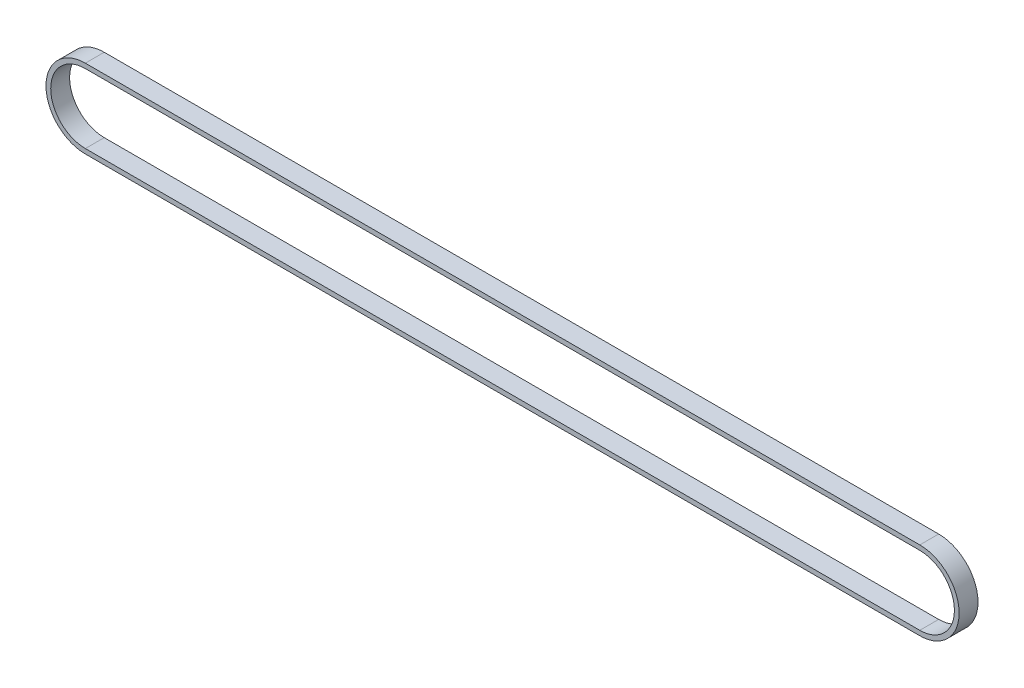
ISO-10303-21;
HEADER;
FILE_DESCRIPTION(('STEP AP214'),'2;1');
FILE_NAME('part.step','',(''),(''),'','','');
FILE_SCHEMA(('AUTOMOTIVE_DESIGN { 1 0 10303 214 1 1 1 1 }'));
ENDSEC;
DATA;
#1=APPLICATION_CONTEXT('core data for automotive mechanical design processes');
#2=APPLICATION_PROTOCOL_DEFINITION('international standard','automotive_design',2000,#1);
#3=PRODUCT_CONTEXT('',#1,'mechanical');
#4=PRODUCT('Part','Part','',(#3));
#5=PRODUCT_RELATED_PRODUCT_CATEGORY('part','',(#4));
#6=PRODUCT_DEFINITION_FORMATION('','',#4);
#7=PRODUCT_DEFINITION_CONTEXT('part definition',#1,'design');
#8=PRODUCT_DEFINITION('design','',#6,#7);
#9=PRODUCT_DEFINITION_SHAPE('','',#8);
#10=(LENGTH_UNIT() NAMED_UNIT(*) SI_UNIT(.MILLI.,.METRE.));
#11=(NAMED_UNIT(*) PLANE_ANGLE_UNIT() SI_UNIT($,.RADIAN.));
#12=(NAMED_UNIT(*) SI_UNIT($,.STERADIAN.) SOLID_ANGLE_UNIT());
#13=UNCERTAINTY_MEASURE_WITH_UNIT(LENGTH_MEASURE(1.E-05),#10,'distance_accuracy_value','');
#14=(GEOMETRIC_REPRESENTATION_CONTEXT(3) GLOBAL_UNCERTAINTY_ASSIGNED_CONTEXT((#13)) GLOBAL_UNIT_ASSIGNED_CONTEXT((#10,
#11,#12)) REPRESENTATION_CONTEXT('',''));
#15=CARTESIAN_POINT('',(0.,0.,0.));
#16=DIRECTION('',(0.,0.,1.));
#17=DIRECTION('',(1.,0.,0.));
#18=AXIS2_PLACEMENT_3D('',#15,#16,#17);
#19=CARTESIAN_POINT('',(265.17,0.,6.));
#20=DIRECTION('',(0.,0.,1.));
#21=DIRECTION('',(1.,0.,0.));
#22=AXIS2_PLACEMENT_3D('',#19,#20,#21);
#23=PLANE('',#22);
#24=CARTESIAN_POINT('',(265.17,0.,6.));
#25=DIRECTION('',(0.,0.,1.));
#26=DIRECTION('',(1.,0.,0.));
#27=AXIS2_PLACEMENT_3D('',#24,#25,#26);
#28=CIRCLE('',#27,12.5);
#29=CARTESIAN_POINT('',(265.17,-12.5,6.));
#30=VERTEX_POINT('',#29);
#31=CARTESIAN_POINT('',(265.17,12.5,6.));
#32=VERTEX_POINT('',#31);
#33=EDGE_CURVE('E133',#30,#32,#28,.T.);
#34=ORIENTED_EDGE('',*,*,#33,.T.);
#35=DIRECTION('',(-1.,0.,0.));
#36=VECTOR('',#35,1.);
#37=CARTESIAN_POINT('',(265.17,12.5,6.));
#38=LINE('',#37,#36);
#39=CARTESIAN_POINT('',(0.,12.5,6.));
#40=VERTEX_POINT('',#39);
#41=EDGE_CURVE('E136',#32,#40,#38,.T.);
#42=ORIENTED_EDGE('',*,*,#41,.T.);
#43=CARTESIAN_POINT('',(0.,0.,6.));
#44=DIRECTION('',(0.,0.,1.));
#45=DIRECTION('',(1.,0.,0.));
#46=AXIS2_PLACEMENT_3D('',#43,#44,#45);
#47=CIRCLE('',#46,12.5);
#48=CARTESIAN_POINT('',(0.,-12.5,6.));
#49=VERTEX_POINT('',#48);
#50=EDGE_CURVE('E139',#40,#49,#47,.T.);
#51=ORIENTED_EDGE('',*,*,#50,.T.);
#52=DIRECTION('',(1.,0.,0.));
#53=VECTOR('',#52,1.);
#54=CARTESIAN_POINT('',(0.,-12.5,6.));
#55=LINE('',#54,#53);
#56=EDGE_CURVE('E141',#49,#30,#55,.T.);
#57=ORIENTED_EDGE('',*,*,#56,.T.);
#58=EDGE_LOOP('',(#34,#42,#51,#57));
#59=FACE_BOUND('',#58,.T.);
#60=DIRECTION('',(1.,0.,0.));
#61=VECTOR('',#60,1.);
#62=CARTESIAN_POINT('',(0.,-11.,6.));
#63=LINE('',#62,#61);
#64=CARTESIAN_POINT('',(0.,-11.,6.));
#65=VERTEX_POINT('',#64);
#66=CARTESIAN_POINT('',(265.17,-11.,6.));
#67=VERTEX_POINT('',#66);
#68=EDGE_CURVE('E105',#65,#67,#63,.T.);
#69=ORIENTED_EDGE('',*,*,#68,.F.);
#70=CARTESIAN_POINT('',(0.,0.,6.));
#71=DIRECTION('',(0.,0.,1.));
#72=DIRECTION('',(1.,0.,0.));
#73=AXIS2_PLACEMENT_3D('',#70,#71,#72);
#74=CIRCLE('',#73,11.);
#75=CARTESIAN_POINT('',(0.,11.,6.));
#76=VERTEX_POINT('',#75);
#77=EDGE_CURVE('E97',#76,#65,#74,.T.);
#78=ORIENTED_EDGE('',*,*,#77,.F.);
#79=DIRECTION('',(-1.,0.,0.));
#80=VECTOR('',#79,1.);
#81=CARTESIAN_POINT('',(265.17,11.,6.));
#82=LINE('',#81,#80);
#83=CARTESIAN_POINT('',(265.17,11.,6.));
#84=VERTEX_POINT('',#83);
#85=EDGE_CURVE('E119',#84,#76,#82,.T.);
#86=ORIENTED_EDGE('',*,*,#85,.F.);
#87=CARTESIAN_POINT('',(265.17,0.,6.));
#88=DIRECTION('',(0.,0.,1.));
#89=DIRECTION('',(1.,0.,0.));
#90=AXIS2_PLACEMENT_3D('',#87,#88,#89);
#91=CIRCLE('',#90,11.);
#92=EDGE_CURVE('E117',#67,#84,#91,.T.);
#93=ORIENTED_EDGE('',*,*,#92,.F.);
#94=EDGE_LOOP('',(#69,#78,#86,#93));
#95=FACE_BOUND('',#94,.T.);
#96=ADVANCED_FACE('F32',(#59,#95),#23,.T.);
#97=CARTESIAN_POINT('',(265.17,0.,0.));
#98=DIRECTION('',(0.,0.,1.));
#99=DIRECTION('',(1.,0.,0.));
#100=AXIS2_PLACEMENT_3D('',#97,#98,#99);
#101=PLANE('',#100);
#102=CARTESIAN_POINT('',(265.17,0.,0.));
#103=DIRECTION('',(0.,0.,1.));
#104=DIRECTION('',(1.,0.,0.));
#105=AXIS2_PLACEMENT_3D('',#102,#103,#104);
#106=CIRCLE('',#105,12.5);
#107=CARTESIAN_POINT('',(265.17,-12.5,0.));
#108=VERTEX_POINT('',#107);
#109=CARTESIAN_POINT('',(265.17,12.5,0.));
#110=VERTEX_POINT('',#109);
#111=EDGE_CURVE('E113',#108,#110,#106,.T.);
#112=ORIENTED_EDGE('',*,*,#111,.F.);
#113=DIRECTION('',(1.,0.,0.));
#114=VECTOR('',#113,1.);
#115=CARTESIAN_POINT('',(0.,-12.5,0.));
#116=LINE('',#115,#114);
#117=CARTESIAN_POINT('',(0.,-12.5,0.));
#118=VERTEX_POINT('',#117);
#119=EDGE_CURVE('E137',#118,#108,#116,.T.);
#120=ORIENTED_EDGE('',*,*,#119,.F.);
#121=CARTESIAN_POINT('',(0.,0.,0.));
#122=DIRECTION('',(0.,0.,1.));
#123=DIRECTION('',(1.,0.,0.));
#124=AXIS2_PLACEMENT_3D('',#121,#122,#123);
#125=CIRCLE('',#124,12.5);
#126=CARTESIAN_POINT('',(0.,12.5,0.));
#127=VERTEX_POINT('',#126);
#128=EDGE_CURVE('E148',#127,#118,#125,.T.);
#129=ORIENTED_EDGE('',*,*,#128,.F.);
#130=DIRECTION('',(-1.,0.,0.));
#131=VECTOR('',#130,1.);
#132=CARTESIAN_POINT('',(265.17,12.5,0.));
#133=LINE('',#132,#131);
#134=EDGE_CURVE('E146',#110,#127,#133,.T.);
#135=ORIENTED_EDGE('',*,*,#134,.F.);
#136=EDGE_LOOP('',(#112,#120,#129,#135));
#137=FACE_BOUND('',#136,.T.);
#138=CARTESIAN_POINT('',(0.,0.,0.));
#139=DIRECTION('',(0.,0.,1.));
#140=DIRECTION('',(1.,0.,0.));
#141=AXIS2_PLACEMENT_3D('',#138,#139,#140);
#142=CIRCLE('',#141,11.);
#143=CARTESIAN_POINT('',(0.,11.,0.));
#144=VERTEX_POINT('',#143);
#145=CARTESIAN_POINT('',(0.,-11.,0.));
#146=VERTEX_POINT('',#145);
#147=EDGE_CURVE('E55',#144,#146,#142,.T.);
#148=ORIENTED_EDGE('',*,*,#147,.T.);
#149=DIRECTION('',(1.,0.,0.));
#150=VECTOR('',#149,1.);
#151=CARTESIAN_POINT('',(0.,-11.,0.));
#152=LINE('',#151,#150);
#153=CARTESIAN_POINT('',(265.17,-11.,0.));
#154=VERTEX_POINT('',#153);
#155=EDGE_CURVE('E112',#146,#154,#152,.T.);
#156=ORIENTED_EDGE('',*,*,#155,.T.);
#157=CARTESIAN_POINT('',(265.17,0.,0.));
#158=DIRECTION('',(0.,0.,1.));
#159=DIRECTION('',(1.,0.,0.));
#160=AXIS2_PLACEMENT_3D('',#157,#158,#159);
#161=CIRCLE('',#160,11.);
#162=CARTESIAN_POINT('',(265.17,11.,0.));
#163=VERTEX_POINT('',#162);
#164=EDGE_CURVE('E125',#154,#163,#161,.T.);
#165=ORIENTED_EDGE('',*,*,#164,.T.);
#166=DIRECTION('',(-1.,0.,0.));
#167=VECTOR('',#166,1.);
#168=CARTESIAN_POINT('',(265.17,11.,0.));
#169=LINE('',#168,#167);
#170=EDGE_CURVE('E106',#163,#144,#169,.T.);
#171=ORIENTED_EDGE('',*,*,#170,.T.);
#172=EDGE_LOOP('',(#148,#156,#165,#171));
#173=FACE_BOUND('',#172,.T.);
#174=ADVANCED_FACE('F166',(#137,#173),#101,.F.);
#175=CARTESIAN_POINT('',(265.17,0.,6.));
#176=DIRECTION('',(0.,0.,-1.));
#177=DIRECTION('',(-1.,0.,0.));
#178=AXIS2_PLACEMENT_3D('',#175,#176,#177);
#179=CYLINDRICAL_SURFACE('',#178,12.5);
#180=ORIENTED_EDGE('',*,*,#111,.T.);
#181=DIRECTION('',(0.,0.,-1.));
#182=VECTOR('',#181,1.);
#183=CARTESIAN_POINT('',(265.17,12.5,6.));
#184=LINE('',#183,#182);
#185=EDGE_CURVE('E11',#32,#110,#184,.T.);
#186=ORIENTED_EDGE('',*,*,#185,.F.);
#187=ORIENTED_EDGE('',*,*,#33,.F.);
#188=DIRECTION('',(0.,0.,-1.));
#189=VECTOR('',#188,1.);
#190=CARTESIAN_POINT('',(265.17,-12.5,6.));
#191=LINE('',#190,#189);
#192=EDGE_CURVE('E143',#30,#108,#191,.T.);
#193=ORIENTED_EDGE('',*,*,#192,.T.);
#194=EDGE_LOOP('',(#180,#186,#187,#193));
#195=FACE_BOUND('',#194,.T.);
#196=ADVANCED_FACE('F34',(#195),#179,.T.);
#197=CARTESIAN_POINT('',(265.17,12.5,6.));
#198=DIRECTION('',(0.,-1.,0.));
#199=DIRECTION('',(1.,0.,0.));
#200=AXIS2_PLACEMENT_3D('',#197,#198,#199);
#201=PLANE('',#200);
#202=ORIENTED_EDGE('',*,*,#134,.T.);
#203=DIRECTION('',(0.,0.,-1.));
#204=VECTOR('',#203,1.);
#205=CARTESIAN_POINT('',(0.,12.5,6.));
#206=LINE('',#205,#204);
#207=EDGE_CURVE('E40',#40,#127,#206,.T.);
#208=ORIENTED_EDGE('',*,*,#207,.F.);
#209=ORIENTED_EDGE('',*,*,#41,.F.);
#210=ORIENTED_EDGE('',*,*,#185,.T.);
#211=EDGE_LOOP('',(#202,#208,#209,#210));
#212=FACE_BOUND('',#211,.T.);
#213=ADVANCED_FACE('F176',(#212),#201,.F.);
#214=CARTESIAN_POINT('',(0.,0.,6.));
#215=DIRECTION('',(0.,0.,-1.));
#216=DIRECTION('',(-1.,0.,0.));
#217=AXIS2_PLACEMENT_3D('',#214,#215,#216);
#218=CYLINDRICAL_SURFACE('',#217,12.5);
#219=ORIENTED_EDGE('',*,*,#128,.T.);
#220=DIRECTION('',(0.,0.,-1.));
#221=VECTOR('',#220,1.);
#222=CARTESIAN_POINT('',(0.,-12.5,6.));
#223=LINE('',#222,#221);
#224=EDGE_CURVE('E153',#49,#118,#223,.T.);
#225=ORIENTED_EDGE('',*,*,#224,.F.);
#226=ORIENTED_EDGE('',*,*,#50,.F.);
#227=ORIENTED_EDGE('',*,*,#207,.T.);
#228=EDGE_LOOP('',(#219,#225,#226,#227));
#229=FACE_BOUND('',#228,.T.);
#230=ADVANCED_FACE('F160',(#229),#218,.T.);
#231=CARTESIAN_POINT('',(0.,-12.5,6.));
#232=DIRECTION('',(0.,1.,0.));
#233=DIRECTION('',(-1.,0.,0.));
#234=AXIS2_PLACEMENT_3D('',#231,#232,#233);
#235=PLANE('',#234);
#236=ORIENTED_EDGE('',*,*,#119,.T.);
#237=ORIENTED_EDGE('',*,*,#192,.F.);
#238=ORIENTED_EDGE('',*,*,#56,.F.);
#239=ORIENTED_EDGE('',*,*,#224,.T.);
#240=EDGE_LOOP('',(#236,#237,#238,#239));
#241=FACE_BOUND('',#240,.T.);
#242=ADVANCED_FACE('F170',(#241),#235,.F.);
#243=CARTESIAN_POINT('',(0.,0.,6.));
#244=DIRECTION('',(0.,0.,-1.));
#245=DIRECTION('',(-1.,0.,0.));
#246=AXIS2_PLACEMENT_3D('',#243,#244,#245);
#247=CYLINDRICAL_SURFACE('',#246,11.);
#248=ORIENTED_EDGE('',*,*,#147,.F.);
#249=DIRECTION('',(0.,0.,-1.));
#250=VECTOR('',#249,1.);
#251=CARTESIAN_POINT('',(0.,11.,6.));
#252=LINE('',#251,#250);
#253=EDGE_CURVE('E101',#76,#144,#252,.T.);
#254=ORIENTED_EDGE('',*,*,#253,.F.);
#255=ORIENTED_EDGE('',*,*,#77,.T.);
#256=DIRECTION('',(0.,0.,-1.));
#257=VECTOR('',#256,1.);
#258=CARTESIAN_POINT('',(0.,-11.,6.));
#259=LINE('',#258,#257);
#260=EDGE_CURVE('E100',#65,#146,#259,.T.);
#261=ORIENTED_EDGE('',*,*,#260,.T.);
#262=EDGE_LOOP('',(#248,#254,#255,#261));
#263=FACE_BOUND('',#262,.T.);
#264=ADVANCED_FACE('F99',(#263),#247,.F.);
#265=CARTESIAN_POINT('',(0.,-11.,6.));
#266=DIRECTION('',(0.,1.,0.));
#267=DIRECTION('',(-1.,0.,0.));
#268=AXIS2_PLACEMENT_3D('',#265,#266,#267);
#269=PLANE('',#268);
#270=ORIENTED_EDGE('',*,*,#155,.F.);
#271=ORIENTED_EDGE('',*,*,#260,.F.);
#272=ORIENTED_EDGE('',*,*,#68,.T.);
#273=DIRECTION('',(0.,0.,-1.));
#274=VECTOR('',#273,1.);
#275=CARTESIAN_POINT('',(265.17,-11.,6.));
#276=LINE('',#275,#274);
#277=EDGE_CURVE('E114',#67,#154,#276,.T.);
#278=ORIENTED_EDGE('',*,*,#277,.T.);
#279=EDGE_LOOP('',(#270,#271,#272,#278));
#280=FACE_BOUND('',#279,.T.);
#281=ADVANCED_FACE('F109',(#280),#269,.T.);
#282=CARTESIAN_POINT('',(265.17,0.,6.));
#283=DIRECTION('',(0.,0.,-1.));
#284=DIRECTION('',(-1.,0.,0.));
#285=AXIS2_PLACEMENT_3D('',#282,#283,#284);
#286=CYLINDRICAL_SURFACE('',#285,11.);
#287=ORIENTED_EDGE('',*,*,#164,.F.);
#288=ORIENTED_EDGE('',*,*,#277,.F.);
#289=ORIENTED_EDGE('',*,*,#92,.T.);
#290=DIRECTION('',(0.,0.,-1.));
#291=VECTOR('',#290,1.);
#292=CARTESIAN_POINT('',(265.17,11.,6.));
#293=LINE('',#292,#291);
#294=EDGE_CURVE('E47',#84,#163,#293,.T.);
#295=ORIENTED_EDGE('',*,*,#294,.T.);
#296=EDGE_LOOP('',(#287,#288,#289,#295));
#297=FACE_BOUND('',#296,.T.);
#298=ADVANCED_FACE('F199',(#297),#286,.F.);
#299=CARTESIAN_POINT('',(265.17,11.,6.));
#300=DIRECTION('',(0.,-1.,0.));
#301=DIRECTION('',(1.,0.,0.));
#302=AXIS2_PLACEMENT_3D('',#299,#300,#301);
#303=PLANE('',#302);
#304=ORIENTED_EDGE('',*,*,#170,.F.);
#305=ORIENTED_EDGE('',*,*,#294,.F.);
#306=ORIENTED_EDGE('',*,*,#85,.T.);
#307=ORIENTED_EDGE('',*,*,#253,.T.);
#308=EDGE_LOOP('',(#304,#305,#306,#307));
#309=FACE_BOUND('',#308,.T.);
#310=ADVANCED_FACE('F203',(#309),#303,.T.);
#311=CLOSED_SHELL('',(#96,#174,#196,#213,#230,#242,#264,#281,#298,#310));
#312=MANIFOLD_SOLID_BREP('B2',#311);
#313=ADVANCED_BREP_SHAPE_REPRESENTATION('',(#18,#312),#14);
#314=SHAPE_DEFINITION_REPRESENTATION(#9,#313);
ENDSEC;
END-ISO-10303-21;
